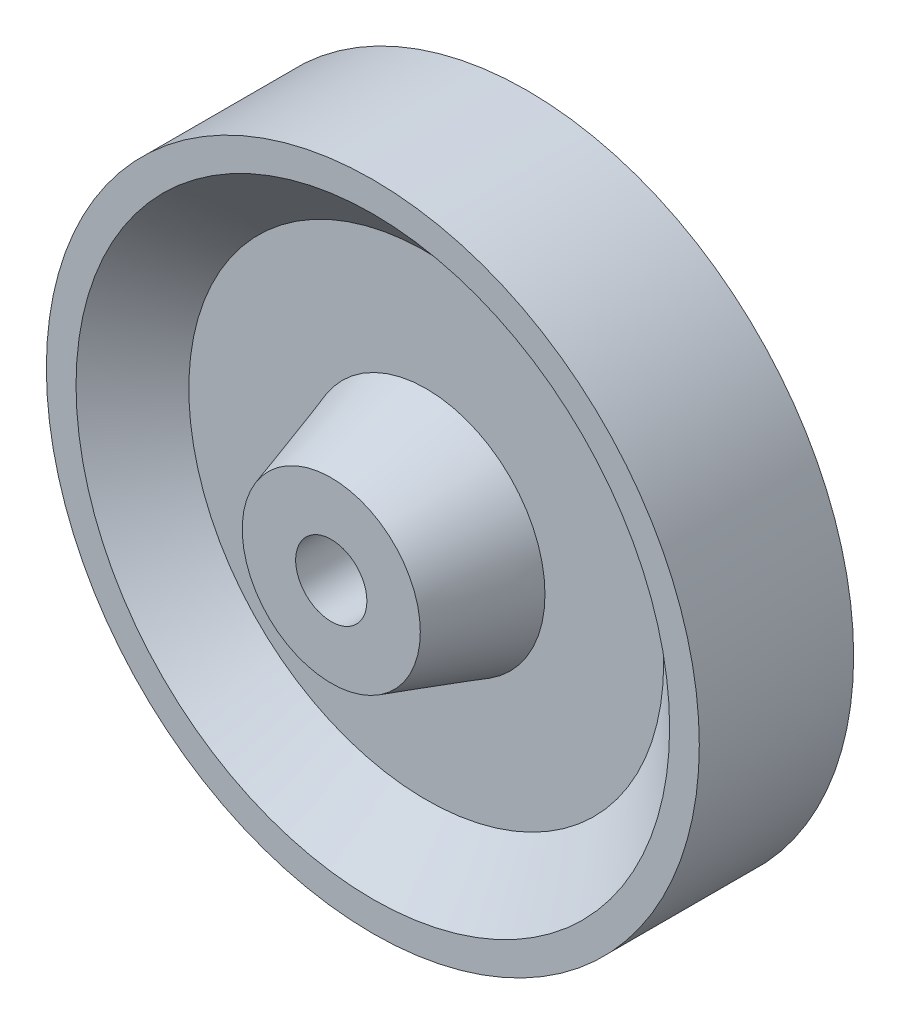
ISO-10303-21;
HEADER;
FILE_DESCRIPTION(('STEP AP214'),'2;1');
FILE_NAME('part.step','',(''),(''),'','','');
FILE_SCHEMA(('AUTOMOTIVE_DESIGN { 1 0 10303 214 1 1 1 1 }'));
ENDSEC;
DATA;
#1=APPLICATION_CONTEXT('core data for automotive mechanical design processes');
#2=APPLICATION_PROTOCOL_DEFINITION('international standard','automotive_design',2000,#1);
#3=PRODUCT_CONTEXT('',#1,'mechanical');
#4=PRODUCT('Part','Part','',(#3));
#5=PRODUCT_RELATED_PRODUCT_CATEGORY('part','',(#4));
#6=PRODUCT_DEFINITION_FORMATION('','',#4);
#7=PRODUCT_DEFINITION_CONTEXT('part definition',#1,'design');
#8=PRODUCT_DEFINITION('design','',#6,#7);
#9=PRODUCT_DEFINITION_SHAPE('','',#8);
#10=(LENGTH_UNIT() NAMED_UNIT(*) SI_UNIT(.MILLI.,.METRE.));
#11=(NAMED_UNIT(*) PLANE_ANGLE_UNIT() SI_UNIT($,.RADIAN.));
#12=(NAMED_UNIT(*) SI_UNIT($,.STERADIAN.) SOLID_ANGLE_UNIT());
#13=UNCERTAINTY_MEASURE_WITH_UNIT(LENGTH_MEASURE(1.E-05),#10,'distance_accuracy_value','');
#14=(GEOMETRIC_REPRESENTATION_CONTEXT(3) GLOBAL_UNCERTAINTY_ASSIGNED_CONTEXT((#13)) GLOBAL_UNIT_ASSIGNED_CONTEXT((#10,
#11,#12)) REPRESENTATION_CONTEXT('',''));
#15=CARTESIAN_POINT('',(0.,0.,0.));
#16=DIRECTION('',(0.,0.,1.));
#17=DIRECTION('',(1.,0.,0.));
#18=AXIS2_PLACEMENT_3D('',#15,#16,#17);
#19=CARTESIAN_POINT('',(0.,0.,0.));
#20=DIRECTION('',(0.,0.,1.));
#21=DIRECTION('',(1.,0.,0.));
#22=AXIS2_PLACEMENT_3D('',#19,#20,#21);
#23=CYLINDRICAL_SURFACE('',#22,55.);
#24=CARTESIAN_POINT('',(0.,0.,13.));
#25=DIRECTION('',(0.,0.,1.));
#26=DIRECTION('',(1.,0.,0.));
#27=AXIS2_PLACEMENT_3D('',#24,#25,#26);
#28=CIRCLE('',#27,55.);
#29=CARTESIAN_POINT('',(55.,0.,13.));
#30=VERTEX_POINT('',#29);
#31=EDGE_CURVE('E79',#30,#30,#28,.T.);
#32=ORIENTED_EDGE('',*,*,#31,.F.);
#33=EDGE_LOOP('',(#32));
#34=FACE_BOUND('',#33,.T.);
#35=CARTESIAN_POINT('',(0.,0.,-13.));
#36=DIRECTION('',(0.,0.,1.));
#37=DIRECTION('',(1.,0.,0.));
#38=AXIS2_PLACEMENT_3D('',#35,#36,#37);
#39=CIRCLE('',#38,55.);
#40=CARTESIAN_POINT('',(55.,0.,-13.));
#41=VERTEX_POINT('',#40);
#42=EDGE_CURVE('E10',#41,#41,#39,.T.);
#43=ORIENTED_EDGE('',*,*,#42,.T.);
#44=EDGE_LOOP('',(#43));
#45=FACE_BOUND('',#44,.T.);
#46=ADVANCED_FACE('F39',(#34,#45),#23,.T.);
#47=CARTESIAN_POINT('',(0.,55.,-13.));
#48=DIRECTION('',(0.,0.,1.));
#49=DIRECTION('',(1.,0.,0.));
#50=AXIS2_PLACEMENT_3D('',#47,#48,#49);
#51=PLANE('',#50);
#52=ORIENTED_EDGE('',*,*,#42,.F.);
#53=EDGE_LOOP('',(#52));
#54=FACE_BOUND('',#53,.T.);
#55=CARTESIAN_POINT('',(0.,0.,-13.));
#56=DIRECTION('',(0.,0.,1.));
#57=DIRECTION('',(1.,0.,0.));
#58=AXIS2_PLACEMENT_3D('',#55,#56,#57);
#59=CIRCLE('',#58,50.);
#60=CARTESIAN_POINT('',(50.,0.,-13.));
#61=VERTEX_POINT('',#60);
#62=EDGE_CURVE('E45',#61,#61,#59,.T.);
#63=ORIENTED_EDGE('',*,*,#62,.T.);
#64=EDGE_LOOP('',(#63));
#65=FACE_BOUND('',#64,.T.);
#66=ADVANCED_FACE('F86',(#54,#65),#51,.F.);
#67=CARTESIAN_POINT('',(0.,0.,-4.));
#68=DIRECTION('',(0.,0.,-1.));
#69=DIRECTION('',(-1.,0.,0.));
#70=AXIS2_PLACEMENT_3D('',#67,#68,#69);
#71=CONICAL_SURFACE('',#70,40.,0.83798122500839);
#72=ORIENTED_EDGE('',*,*,#62,.F.);
#73=EDGE_LOOP('',(#72));
#74=FACE_BOUND('',#73,.T.);
#75=CARTESIAN_POINT('',(0.,0.,-4.));
#76=DIRECTION('',(0.,0.,1.));
#77=DIRECTION('',(1.,0.,0.));
#78=AXIS2_PLACEMENT_3D('',#75,#76,#77);
#79=CIRCLE('',#78,40.);
#80=CARTESIAN_POINT('',(40.,0.,-4.));
#81=VERTEX_POINT('',#80);
#82=EDGE_CURVE('E49',#81,#81,#79,.T.);
#83=ORIENTED_EDGE('',*,*,#82,.T.);
#84=EDGE_LOOP('',(#83));
#85=FACE_BOUND('',#84,.T.);
#86=ADVANCED_FACE('F90',(#74,#85),#71,.F.);
#87=CARTESIAN_POINT('',(0.,40.,-4.));
#88=DIRECTION('',(0.,0.,1.));
#89=DIRECTION('',(1.,0.,0.));
#90=AXIS2_PLACEMENT_3D('',#87,#88,#89);
#91=PLANE('',#90);
#92=ORIENTED_EDGE('',*,*,#82,.F.);
#93=EDGE_LOOP('',(#92));
#94=FACE_BOUND('',#93,.T.);
#95=CARTESIAN_POINT('',(0.,0.,-4.));
#96=DIRECTION('',(0.,0.,1.));
#97=DIRECTION('',(1.,0.,0.));
#98=AXIS2_PLACEMENT_3D('',#95,#96,#97);
#99=CIRCLE('',#98,20.);
#100=CARTESIAN_POINT('',(20.,0.,-4.));
#101=VERTEX_POINT('',#100);
#102=EDGE_CURVE('E53',#101,#101,#99,.T.);
#103=ORIENTED_EDGE('',*,*,#102,.T.);
#104=EDGE_LOOP('',(#103));
#105=FACE_BOUND('',#104,.T.);
#106=ADVANCED_FACE('F95',(#94,#105),#91,.F.);
#107=CARTESIAN_POINT('',(0.,0.,-20.));
#108=DIRECTION('',(0.,0.,1.));
#109=DIRECTION('',(1.,0.,0.));
#110=AXIS2_PLACEMENT_3D('',#107,#108,#109);
#111=CONICAL_SURFACE('',#110,15.,0.302884868374972);
#112=ORIENTED_EDGE('',*,*,#102,.F.);
#113=EDGE_LOOP('',(#112));
#114=FACE_BOUND('',#113,.T.);
#115=CARTESIAN_POINT('',(0.,0.,-20.));
#116=DIRECTION('',(0.,0.,1.));
#117=DIRECTION('',(1.,0.,0.));
#118=AXIS2_PLACEMENT_3D('',#115,#116,#117);
#119=CIRCLE('',#118,15.);
#120=CARTESIAN_POINT('',(15.,0.,-20.));
#121=VERTEX_POINT('',#120);
#122=EDGE_CURVE('E58',#121,#121,#119,.T.);
#123=ORIENTED_EDGE('',*,*,#122,.T.);
#124=EDGE_LOOP('',(#123));
#125=FACE_BOUND('',#124,.T.);
#126=ADVANCED_FACE('F101',(#114,#125),#111,.T.);
#127=CARTESIAN_POINT('',(0.,15.,-20.));
#128=DIRECTION('',(0.,0.,1.));
#129=DIRECTION('',(1.,0.,0.));
#130=AXIS2_PLACEMENT_3D('',#127,#128,#129);
#131=PLANE('',#130);
#132=ORIENTED_EDGE('',*,*,#122,.F.);
#133=EDGE_LOOP('',(#132));
#134=FACE_BOUND('',#133,.T.);
#135=CARTESIAN_POINT('',(0.,0.,-20.));
#136=DIRECTION('',(0.,0.,1.));
#137=DIRECTION('',(1.,0.,0.));
#138=AXIS2_PLACEMENT_3D('',#135,#136,#137);
#139=CIRCLE('',#138,6.);
#140=CARTESIAN_POINT('',(6.,0.,-20.));
#141=VERTEX_POINT('',#140);
#142=EDGE_CURVE('E61',#141,#141,#139,.T.);
#143=ORIENTED_EDGE('',*,*,#142,.T.);
#144=EDGE_LOOP('',(#143));
#145=FACE_BOUND('',#144,.T.);
#146=ADVANCED_FACE('F105',(#134,#145),#131,.F.);
#147=CARTESIAN_POINT('',(0.,0.,0.));
#148=DIRECTION('',(0.,0.,1.));
#149=DIRECTION('',(1.,0.,0.));
#150=AXIS2_PLACEMENT_3D('',#147,#148,#149);
#151=CYLINDRICAL_SURFACE('',#150,6.);
#152=ORIENTED_EDGE('',*,*,#142,.F.);
#153=EDGE_LOOP('',(#152));
#154=FACE_BOUND('',#153,.T.);
#155=CARTESIAN_POINT('',(0.,0.,20.));
#156=DIRECTION('',(0.,0.,1.));
#157=DIRECTION('',(1.,0.,0.));
#158=AXIS2_PLACEMENT_3D('',#155,#156,#157);
#159=CIRCLE('',#158,6.);
#160=CARTESIAN_POINT('',(6.,0.,20.));
#161=VERTEX_POINT('',#160);
#162=EDGE_CURVE('E64',#161,#161,#159,.T.);
#163=ORIENTED_EDGE('',*,*,#162,.T.);
#164=EDGE_LOOP('',(#163));
#165=FACE_BOUND('',#164,.T.);
#166=ADVANCED_FACE('F109',(#154,#165),#151,.F.);
#167=CARTESIAN_POINT('',(0.,15.,20.));
#168=DIRECTION('',(0.,0.,-1.));
#169=DIRECTION('',(-1.,0.,0.));
#170=AXIS2_PLACEMENT_3D('',#167,#168,#169);
#171=PLANE('',#170);
#172=ORIENTED_EDGE('',*,*,#162,.F.);
#173=EDGE_LOOP('',(#172));
#174=FACE_BOUND('',#173,.T.);
#175=CARTESIAN_POINT('',(0.,0.,20.));
#176=DIRECTION('',(0.,0.,1.));
#177=DIRECTION('',(1.,0.,0.));
#178=AXIS2_PLACEMENT_3D('',#175,#176,#177);
#179=CIRCLE('',#178,15.);
#180=CARTESIAN_POINT('',(15.,0.,20.));
#181=VERTEX_POINT('',#180);
#182=EDGE_CURVE('E67',#181,#181,#179,.T.);
#183=ORIENTED_EDGE('',*,*,#182,.T.);
#184=EDGE_LOOP('',(#183));
#185=FACE_BOUND('',#184,.T.);
#186=ADVANCED_FACE('F113',(#174,#185),#171,.F.);
#187=CARTESIAN_POINT('',(0.,0.,4.));
#188=DIRECTION('',(0.,0.,-1.));
#189=DIRECTION('',(-1.,0.,0.));
#190=AXIS2_PLACEMENT_3D('',#187,#188,#189);
#191=CONICAL_SURFACE('',#190,20.,0.302884868374972);
#192=ORIENTED_EDGE('',*,*,#182,.F.);
#193=EDGE_LOOP('',(#192));
#194=FACE_BOUND('',#193,.T.);
#195=CARTESIAN_POINT('',(0.,0.,4.));
#196=DIRECTION('',(0.,0.,1.));
#197=DIRECTION('',(1.,0.,0.));
#198=AXIS2_PLACEMENT_3D('',#195,#196,#197);
#199=CIRCLE('',#198,20.);
#200=CARTESIAN_POINT('',(20.,0.,4.));
#201=VERTEX_POINT('',#200);
#202=EDGE_CURVE('E70',#201,#201,#199,.T.);
#203=ORIENTED_EDGE('',*,*,#202,.T.);
#204=EDGE_LOOP('',(#203));
#205=FACE_BOUND('',#204,.T.);
#206=ADVANCED_FACE('F117',(#194,#205),#191,.T.);
#207=CARTESIAN_POINT('',(0.,40.,4.));
#208=DIRECTION('',(0.,0.,-1.));
#209=DIRECTION('',(-1.,0.,0.));
#210=AXIS2_PLACEMENT_3D('',#207,#208,#209);
#211=PLANE('',#210);
#212=ORIENTED_EDGE('',*,*,#202,.F.);
#213=EDGE_LOOP('',(#212));
#214=FACE_BOUND('',#213,.T.);
#215=CARTESIAN_POINT('',(0.,0.,4.));
#216=DIRECTION('',(0.,0.,1.));
#217=DIRECTION('',(1.,0.,0.));
#218=AXIS2_PLACEMENT_3D('',#215,#216,#217);
#219=CIRCLE('',#218,40.);
#220=CARTESIAN_POINT('',(40.,0.,4.));
#221=VERTEX_POINT('',#220);
#222=EDGE_CURVE('E73',#221,#221,#219,.T.);
#223=ORIENTED_EDGE('',*,*,#222,.T.);
#224=EDGE_LOOP('',(#223));
#225=FACE_BOUND('',#224,.T.);
#226=ADVANCED_FACE('F121',(#214,#225),#211,.F.);
#227=CARTESIAN_POINT('',(0.,0.,13.));
#228=DIRECTION('',(0.,0.,1.));
#229=DIRECTION('',(1.,0.,0.));
#230=AXIS2_PLACEMENT_3D('',#227,#228,#229);
#231=CONICAL_SURFACE('',#230,50.,0.83798122500839);
#232=ORIENTED_EDGE('',*,*,#222,.F.);
#233=EDGE_LOOP('',(#232));
#234=FACE_BOUND('',#233,.T.);
#235=CARTESIAN_POINT('',(0.,0.,13.));
#236=DIRECTION('',(0.,0.,1.));
#237=DIRECTION('',(1.,0.,0.));
#238=AXIS2_PLACEMENT_3D('',#235,#236,#237);
#239=CIRCLE('',#238,50.);
#240=CARTESIAN_POINT('',(50.,0.,13.));
#241=VERTEX_POINT('',#240);
#242=EDGE_CURVE('E76',#241,#241,#239,.T.);
#243=ORIENTED_EDGE('',*,*,#242,.T.);
#244=EDGE_LOOP('',(#243));
#245=FACE_BOUND('',#244,.T.);
#246=ADVANCED_FACE('F125',(#234,#245),#231,.F.);
#247=CARTESIAN_POINT('',(0.,55.,13.));
#248=DIRECTION('',(0.,0.,-1.));
#249=DIRECTION('',(-1.,0.,0.));
#250=AXIS2_PLACEMENT_3D('',#247,#248,#249);
#251=PLANE('',#250);
#252=ORIENTED_EDGE('',*,*,#242,.F.);
#253=EDGE_LOOP('',(#252));
#254=FACE_BOUND('',#253,.T.);
#255=ORIENTED_EDGE('',*,*,#31,.T.);
#256=EDGE_LOOP('',(#255));
#257=FACE_BOUND('',#256,.T.);
#258=ADVANCED_FACE('F83',(#254,#257),#251,.F.);
#259=CLOSED_SHELL('',(#46,#66,#86,#106,#126,#146,#166,#186,#206,#226,#246,#258));
#260=MANIFOLD_SOLID_BREP('B2',#259);
#261=ADVANCED_BREP_SHAPE_REPRESENTATION('',(#18,#260),#14);
#262=SHAPE_DEFINITION_REPRESENTATION(#9,#261);
ENDSEC;
END-ISO-10303-21;
